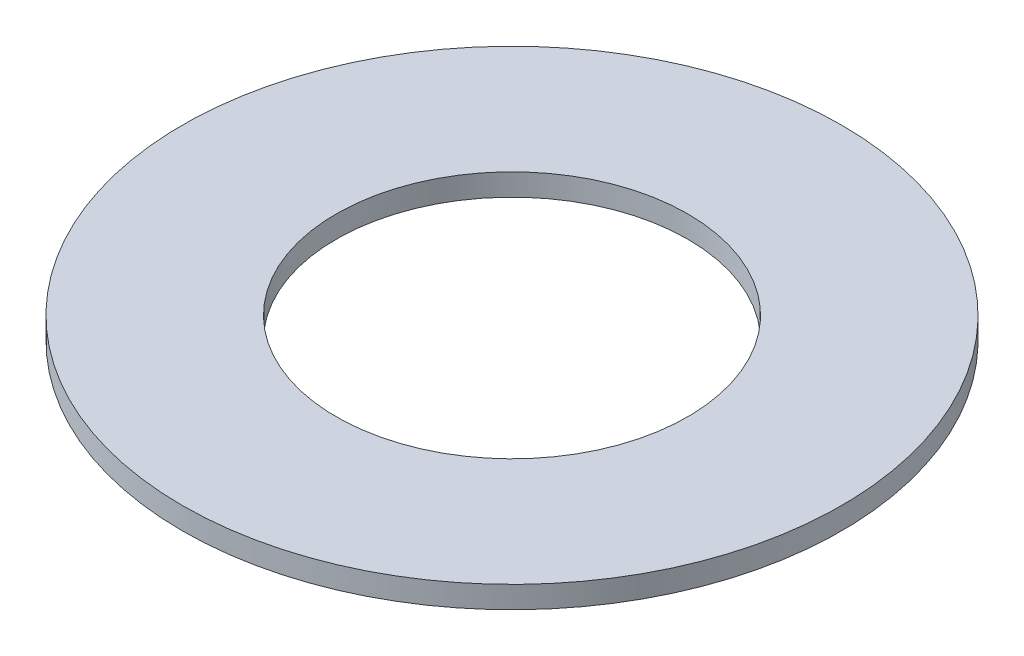
ISO-10303-21;
HEADER;
FILE_DESCRIPTION(('STEP AP214'),'2;1');
FILE_NAME('part.step','',(''),(''),'','','');
FILE_SCHEMA(('AUTOMOTIVE_DESIGN { 1 0 10303 214 1 1 1 1 }'));
ENDSEC;
DATA;
#1=APPLICATION_CONTEXT('core data for automotive mechanical design processes');
#2=APPLICATION_PROTOCOL_DEFINITION('international standard','automotive_design',2000,#1);
#3=PRODUCT_CONTEXT('',#1,'mechanical');
#4=PRODUCT('Part','Part','',(#3));
#5=PRODUCT_RELATED_PRODUCT_CATEGORY('part','',(#4));
#6=PRODUCT_DEFINITION_FORMATION('','',#4);
#7=PRODUCT_DEFINITION_CONTEXT('part definition',#1,'design');
#8=PRODUCT_DEFINITION('design','',#6,#7);
#9=PRODUCT_DEFINITION_SHAPE('','',#8);
#10=(LENGTH_UNIT() NAMED_UNIT(*) SI_UNIT(.MILLI.,.METRE.));
#11=(NAMED_UNIT(*) PLANE_ANGLE_UNIT() SI_UNIT($,.RADIAN.));
#12=(NAMED_UNIT(*) SI_UNIT($,.STERADIAN.) SOLID_ANGLE_UNIT());
#13=UNCERTAINTY_MEASURE_WITH_UNIT(LENGTH_MEASURE(1.E-05),#10,'distance_accuracy_value','');
#14=(GEOMETRIC_REPRESENTATION_CONTEXT(3) GLOBAL_UNCERTAINTY_ASSIGNED_CONTEXT((#13)) GLOBAL_UNIT_ASSIGNED_CONTEXT((#10,
#11,#12)) REPRESENTATION_CONTEXT('',''));
#15=CARTESIAN_POINT('',(0.,0.,0.));
#16=DIRECTION('',(0.,0.,1.));
#17=DIRECTION('',(1.,0.,0.));
#18=AXIS2_PLACEMENT_3D('',#15,#16,#17);
#19=CARTESIAN_POINT('',(0.,0.2,-3.));
#20=DIRECTION('',(0.,1.,0.));
#21=DIRECTION('',(0.,0.,1.));
#22=AXIS2_PLACEMENT_3D('',#19,#20,#21);
#23=PLANE('',#22);
#24=CARTESIAN_POINT('',(0.,0.2,0.));
#25=DIRECTION('',(0.,-1.,0.));
#26=DIRECTION('',(0.,0.,-1.));
#27=AXIS2_PLACEMENT_3D('',#24,#25,#26);
#28=CIRCLE('',#27,3.);
#29=CARTESIAN_POINT('',(0.,0.2,-3.));
#30=VERTEX_POINT('',#29);
#31=EDGE_CURVE('E17',#30,#30,#28,.T.);
#32=ORIENTED_EDGE('',*,*,#31,.F.);
#33=EDGE_LOOP('',(#32));
#34=FACE_BOUND('',#33,.T.);
#35=CARTESIAN_POINT('',(0.,0.2,0.));
#36=DIRECTION('',(0.,-1.,0.));
#37=DIRECTION('',(0.,0.,-1.));
#38=AXIS2_PLACEMENT_3D('',#35,#36,#37);
#39=CIRCLE('',#38,1.6);
#40=CARTESIAN_POINT('',(0.,0.2,-1.6));
#41=VERTEX_POINT('',#40);
#42=EDGE_CURVE('E29',#41,#41,#39,.T.);
#43=ORIENTED_EDGE('',*,*,#42,.T.);
#44=EDGE_LOOP('',(#43));
#45=FACE_BOUND('',#44,.T.);
#46=ADVANCED_FACE('F14',(#34,#45),#23,.T.);
#47=CARTESIAN_POINT('',(0.,0.,0.));
#48=DIRECTION('',(0.,-1.,0.));
#49=DIRECTION('',(0.,0.,-1.));
#50=AXIS2_PLACEMENT_3D('',#47,#48,#49);
#51=CYLINDRICAL_SURFACE('',#50,3.);
#52=ORIENTED_EDGE('',*,*,#31,.T.);
#53=EDGE_LOOP('',(#52));
#54=FACE_BOUND('',#53,.T.);
#55=CARTESIAN_POINT('',(0.,0.,0.));
#56=DIRECTION('',(0.,-1.,0.));
#57=DIRECTION('',(0.,0.,-1.));
#58=AXIS2_PLACEMENT_3D('',#55,#56,#57);
#59=CIRCLE('',#58,3.);
#60=CARTESIAN_POINT('',(0.,0.,-3.));
#61=VERTEX_POINT('',#60);
#62=EDGE_CURVE('E22',#61,#61,#59,.T.);
#63=ORIENTED_EDGE('',*,*,#62,.F.);
#64=EDGE_LOOP('',(#63));
#65=FACE_BOUND('',#64,.T.);
#66=ADVANCED_FACE('F39',(#54,#65),#51,.T.);
#67=CARTESIAN_POINT('',(0.,0.,0.));
#68=DIRECTION('',(0.,-1.,0.));
#69=DIRECTION('',(0.,0.,-1.));
#70=AXIS2_PLACEMENT_3D('',#67,#68,#69);
#71=CYLINDRICAL_SURFACE('',#70,1.6);
#72=CARTESIAN_POINT('',(0.,0.,0.));
#73=DIRECTION('',(0.,-1.,0.));
#74=DIRECTION('',(0.,0.,-1.));
#75=AXIS2_PLACEMENT_3D('',#72,#73,#74);
#76=CIRCLE('',#75,1.6);
#77=CARTESIAN_POINT('',(0.,0.,-1.6));
#78=VERTEX_POINT('',#77);
#79=EDGE_CURVE('E10',#78,#78,#76,.F.);
#80=ORIENTED_EDGE('',*,*,#79,.F.);
#81=EDGE_LOOP('',(#80));
#82=FACE_BOUND('',#81,.T.);
#83=ORIENTED_EDGE('',*,*,#42,.F.);
#84=EDGE_LOOP('',(#83));
#85=FACE_BOUND('',#84,.T.);
#86=ADVANCED_FACE('F47',(#82,#85),#71,.F.);
#87=CARTESIAN_POINT('',(0.,0.,-3.));
#88=DIRECTION('',(0.,-1.,0.));
#89=DIRECTION('',(0.,0.,-1.));
#90=AXIS2_PLACEMENT_3D('',#87,#88,#89);
#91=PLANE('',#90);
#92=ORIENTED_EDGE('',*,*,#79,.T.);
#93=EDGE_LOOP('',(#92));
#94=FACE_BOUND('',#93,.T.);
#95=ORIENTED_EDGE('',*,*,#62,.T.);
#96=EDGE_LOOP('',(#95));
#97=FACE_BOUND('',#96,.T.);
#98=ADVANCED_FACE('F48',(#94,#97),#91,.T.);
#99=CLOSED_SHELL('',(#46,#66,#86,#98));
#100=MANIFOLD_SOLID_BREP('B1',#99);
#101=ADVANCED_BREP_SHAPE_REPRESENTATION('',(#18,#100),#14);
#102=SHAPE_DEFINITION_REPRESENTATION(#9,#101);
ENDSEC;
END-ISO-10303-21;
